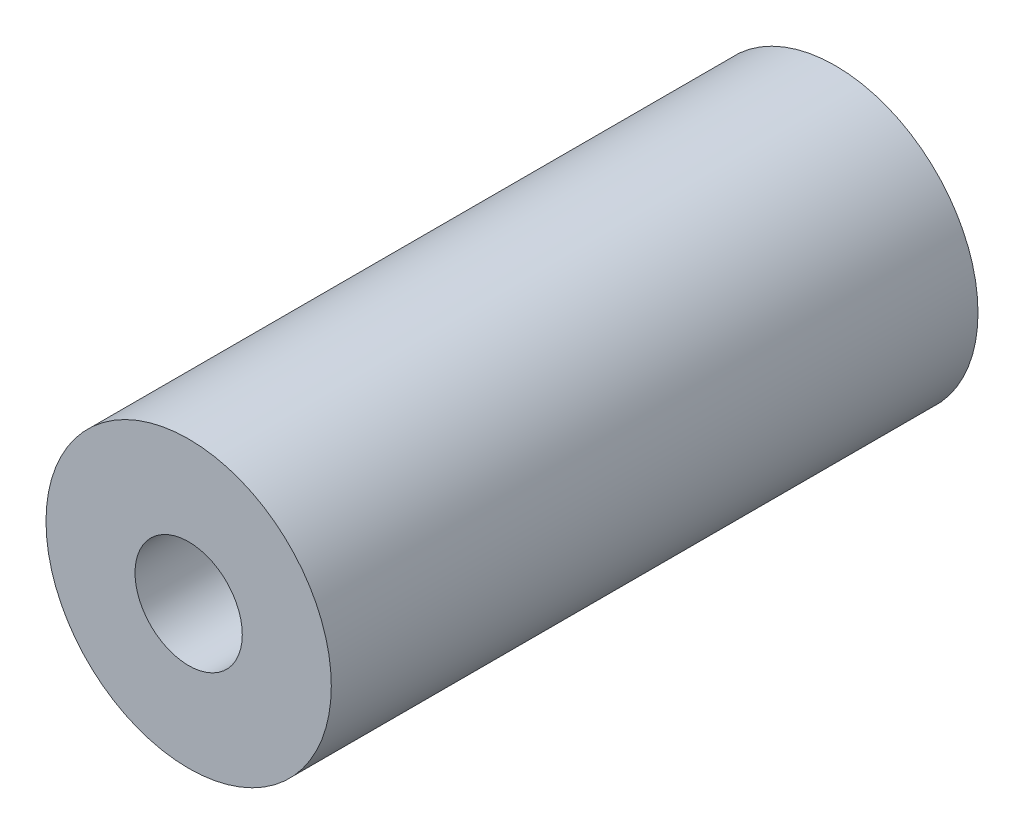
ISO-10303-21;
HEADER;
FILE_DESCRIPTION(('STEP AP214'),'2;1');
FILE_NAME('part.step','',(''),(''),'','','');
FILE_SCHEMA(('AUTOMOTIVE_DESIGN { 1 0 10303 214 1 1 1 1 }'));
ENDSEC;
DATA;
#1=APPLICATION_CONTEXT('core data for automotive mechanical design processes');
#2=APPLICATION_PROTOCOL_DEFINITION('international standard','automotive_design',2000,#1);
#3=PRODUCT_CONTEXT('',#1,'mechanical');
#4=PRODUCT('Part','Part','',(#3));
#5=PRODUCT_RELATED_PRODUCT_CATEGORY('part','',(#4));
#6=PRODUCT_DEFINITION_FORMATION('','',#4);
#7=PRODUCT_DEFINITION_CONTEXT('part definition',#1,'design');
#8=PRODUCT_DEFINITION('design','',#6,#7);
#9=PRODUCT_DEFINITION_SHAPE('','',#8);
#10=(LENGTH_UNIT() NAMED_UNIT(*) SI_UNIT(.MILLI.,.METRE.));
#11=(NAMED_UNIT(*) PLANE_ANGLE_UNIT() SI_UNIT($,.RADIAN.));
#12=(NAMED_UNIT(*) SI_UNIT($,.STERADIAN.) SOLID_ANGLE_UNIT());
#13=UNCERTAINTY_MEASURE_WITH_UNIT(LENGTH_MEASURE(1.E-05),#10,'distance_accuracy_value','');
#14=(GEOMETRIC_REPRESENTATION_CONTEXT(3) GLOBAL_UNCERTAINTY_ASSIGNED_CONTEXT((#13)) GLOBAL_UNIT_ASSIGNED_CONTEXT((#10,
#11,#12)) REPRESENTATION_CONTEXT('',''));
#15=CARTESIAN_POINT('',(0.,0.,0.));
#16=DIRECTION('',(0.,0.,1.));
#17=DIRECTION('',(1.,0.,0.));
#18=AXIS2_PLACEMENT_3D('',#15,#16,#17);
#19=CARTESIAN_POINT('',(0.,0.,17.));
#20=DIRECTION('',(0.,0.,1.));
#21=DIRECTION('',(1.,0.,0.));
#22=AXIS2_PLACEMENT_3D('',#19,#20,#21);
#23=PLANE('',#22);
#24=CARTESIAN_POINT('',(0.,0.,17.));
#25=DIRECTION('',(0.,0.,1.));
#26=DIRECTION('',(1.,0.,0.));
#27=AXIS2_PLACEMENT_3D('',#24,#25,#26);
#28=CIRCLE('',#27,3.75);
#29=CARTESIAN_POINT('',(3.75,0.,17.));
#30=VERTEX_POINT('',#29);
#31=EDGE_CURVE('E10',#30,#30,#28,.T.);
#32=ORIENTED_EDGE('',*,*,#31,.T.);
#33=EDGE_LOOP('',(#32));
#34=FACE_BOUND('',#33,.T.);
#35=CARTESIAN_POINT('',(0.,0.,17.));
#36=DIRECTION('',(0.,0.,1.));
#37=DIRECTION('',(1.,0.,0.));
#38=AXIS2_PLACEMENT_3D('',#35,#36,#37);
#39=CIRCLE('',#38,1.41);
#40=CARTESIAN_POINT('',(1.41,0.,17.));
#41=VERTEX_POINT('',#40);
#42=EDGE_CURVE('E44',#41,#41,#39,.T.);
#43=ORIENTED_EDGE('',*,*,#42,.F.);
#44=EDGE_LOOP('',(#43));
#45=FACE_BOUND('',#44,.T.);
#46=ADVANCED_FACE('F33',(#34,#45),#23,.T.);
#47=CARTESIAN_POINT('',(0.,0.,0.));
#48=DIRECTION('',(0.,0.,1.));
#49=DIRECTION('',(1.,0.,0.));
#50=AXIS2_PLACEMENT_3D('',#47,#48,#49);
#51=PLANE('',#50);
#52=CARTESIAN_POINT('',(0.,0.,0.));
#53=DIRECTION('',(0.,0.,1.));
#54=DIRECTION('',(1.,0.,0.));
#55=AXIS2_PLACEMENT_3D('',#52,#53,#54);
#56=CIRCLE('',#55,3.75);
#57=CARTESIAN_POINT('',(3.75,0.,0.));
#58=VERTEX_POINT('',#57);
#59=EDGE_CURVE('E37',#58,#58,#56,.T.);
#60=ORIENTED_EDGE('',*,*,#59,.F.);
#61=EDGE_LOOP('',(#60));
#62=FACE_BOUND('',#61,.T.);
#63=CARTESIAN_POINT('',(0.,0.,0.));
#64=DIRECTION('',(0.,0.,1.));
#65=DIRECTION('',(1.,0.,0.));
#66=AXIS2_PLACEMENT_3D('',#63,#64,#65);
#67=CIRCLE('',#66,1.41);
#68=CARTESIAN_POINT('',(1.41,0.,0.));
#69=VERTEX_POINT('',#68);
#70=EDGE_CURVE('E46',#69,#69,#67,.T.);
#71=ORIENTED_EDGE('',*,*,#70,.T.);
#72=EDGE_LOOP('',(#71));
#73=FACE_BOUND('',#72,.T.);
#74=ADVANCED_FACE('F56',(#62,#73),#51,.F.);
#75=CARTESIAN_POINT('',(0.,0.,17.));
#76=DIRECTION('',(0.,0.,-1.));
#77=DIRECTION('',(-1.,0.,0.));
#78=AXIS2_PLACEMENT_3D('',#75,#76,#77);
#79=CYLINDRICAL_SURFACE('',#78,3.75);
#80=ORIENTED_EDGE('',*,*,#31,.F.);
#81=EDGE_LOOP('',(#80));
#82=FACE_BOUND('',#81,.T.);
#83=ORIENTED_EDGE('',*,*,#59,.T.);
#84=EDGE_LOOP('',(#83));
#85=FACE_BOUND('',#84,.T.);
#86=ADVANCED_FACE('F35',(#82,#85),#79,.T.);
#87=CARTESIAN_POINT('',(0.,0.,17.));
#88=DIRECTION('',(0.,0.,-1.));
#89=DIRECTION('',(-1.,0.,0.));
#90=AXIS2_PLACEMENT_3D('',#87,#88,#89);
#91=CYLINDRICAL_SURFACE('',#90,1.41);
#92=ORIENTED_EDGE('',*,*,#42,.T.);
#93=EDGE_LOOP('',(#92));
#94=FACE_BOUND('',#93,.T.);
#95=ORIENTED_EDGE('',*,*,#70,.F.);
#96=EDGE_LOOP('',(#95));
#97=FACE_BOUND('',#96,.T.);
#98=ADVANCED_FACE('F52',(#94,#97),#91,.F.);
#99=CLOSED_SHELL('',(#46,#74,#86,#98));
#100=MANIFOLD_SOLID_BREP('B2',#99);
#101=ADVANCED_BREP_SHAPE_REPRESENTATION('',(#18,#100),#14);
#102=SHAPE_DEFINITION_REPRESENTATION(#9,#101);
ENDSEC;
END-ISO-10303-21;
